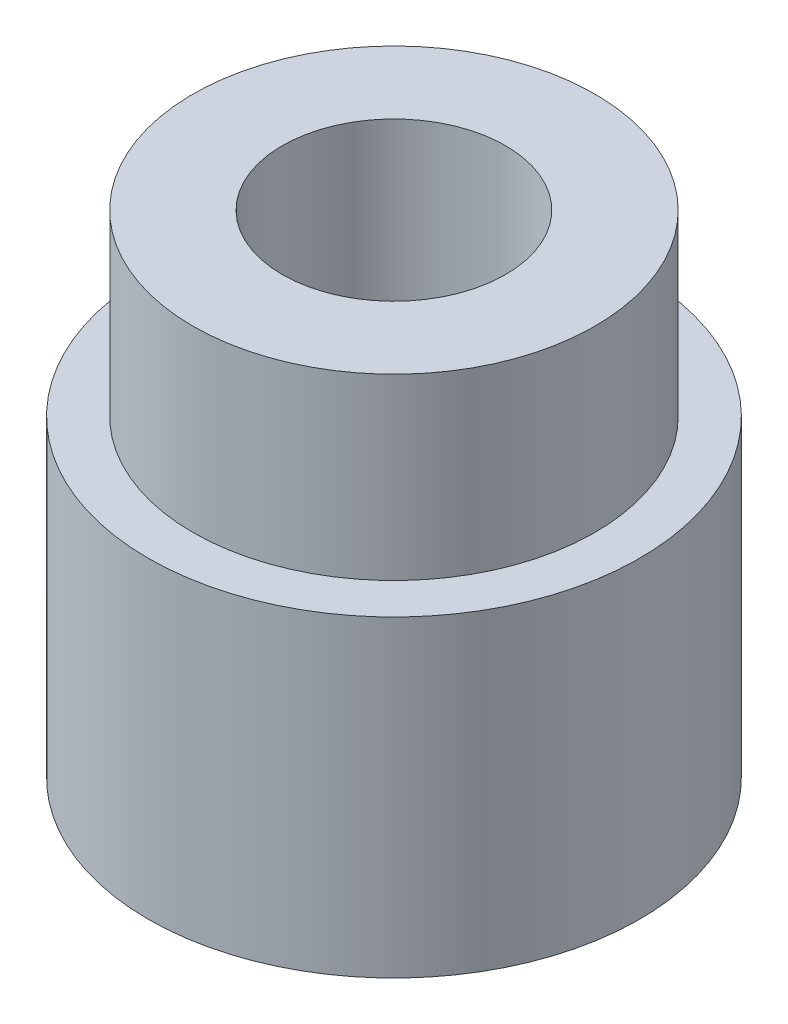
ISO-10303-21;
HEADER;
FILE_DESCRIPTION(('STEP AP214'),'2;1');
FILE_NAME('part.step','',(''),(''),'','','');
FILE_SCHEMA(('AUTOMOTIVE_DESIGN { 1 0 10303 214 1 1 1 1 }'));
ENDSEC;
DATA;
#1=APPLICATION_CONTEXT('core data for automotive mechanical design processes');
#2=APPLICATION_PROTOCOL_DEFINITION('international standard','automotive_design',2000,#1);
#3=PRODUCT_CONTEXT('',#1,'mechanical');
#4=PRODUCT('Part','Part','',(#3));
#5=PRODUCT_RELATED_PRODUCT_CATEGORY('part','',(#4));
#6=PRODUCT_DEFINITION_FORMATION('','',#4);
#7=PRODUCT_DEFINITION_CONTEXT('part definition',#1,'design');
#8=PRODUCT_DEFINITION('design','',#6,#7);
#9=PRODUCT_DEFINITION_SHAPE('','',#8);
#10=(LENGTH_UNIT() NAMED_UNIT(*) SI_UNIT(.MILLI.,.METRE.));
#11=(NAMED_UNIT(*) PLANE_ANGLE_UNIT() SI_UNIT($,.RADIAN.));
#12=(NAMED_UNIT(*) SI_UNIT($,.STERADIAN.) SOLID_ANGLE_UNIT());
#13=UNCERTAINTY_MEASURE_WITH_UNIT(LENGTH_MEASURE(1.E-05),#10,'distance_accuracy_value','');
#14=(GEOMETRIC_REPRESENTATION_CONTEXT(3) GLOBAL_UNCERTAINTY_ASSIGNED_CONTEXT((#13)) GLOBAL_UNIT_ASSIGNED_CONTEXT((#10,
#11,#12)) REPRESENTATION_CONTEXT('',''));
#15=CARTESIAN_POINT('',(0.,0.,0.));
#16=DIRECTION('',(0.,0.,1.));
#17=DIRECTION('',(1.,0.,0.));
#18=AXIS2_PLACEMENT_3D('',#15,#16,#17);
#19=CARTESIAN_POINT('',(0.,7.,0.));
#20=DIRECTION('',(0.,1.,0.));
#21=DIRECTION('',(0.,0.,1.));
#22=AXIS2_PLACEMENT_3D('',#19,#20,#21);
#23=PLANE('',#22);
#24=CARTESIAN_POINT('',(0.,7.,0.));
#25=DIRECTION('',(0.,1.,0.));
#26=DIRECTION('',(0.,0.,1.));
#27=AXIS2_PLACEMENT_3D('',#24,#25,#26);
#28=CIRCLE('',#27,5.5);
#29=CARTESIAN_POINT('',(0.,7.,5.5));
#30=VERTEX_POINT('',#29);
#31=EDGE_CURVE('E10',#30,#30,#28,.T.);
#32=ORIENTED_EDGE('',*,*,#31,.T.);
#33=EDGE_LOOP('',(#32));
#34=FACE_BOUND('',#33,.T.);
#35=CARTESIAN_POINT('',(0.,7.,0.));
#36=DIRECTION('',(0.,1.,0.));
#37=DIRECTION('',(0.,0.,1.));
#38=AXIS2_PLACEMENT_3D('',#35,#36,#37);
#39=CIRCLE('',#38,4.5);
#40=CARTESIAN_POINT('',(0.,7.,4.5));
#41=VERTEX_POINT('',#40);
#42=EDGE_CURVE('E44',#41,#41,#39,.T.);
#43=ORIENTED_EDGE('',*,*,#42,.F.);
#44=EDGE_LOOP('',(#43));
#45=FACE_BOUND('',#44,.T.);
#46=ADVANCED_FACE('F31',(#34,#45),#23,.T.);
#47=CARTESIAN_POINT('',(0.,7.,0.));
#48=DIRECTION('',(0.,-1.,0.));
#49=DIRECTION('',(0.,0.,-1.));
#50=AXIS2_PLACEMENT_3D('',#47,#48,#49);
#51=CYLINDRICAL_SURFACE('',#50,5.5);
#52=ORIENTED_EDGE('',*,*,#31,.F.);
#53=EDGE_LOOP('',(#52));
#54=FACE_BOUND('',#53,.T.);
#55=CARTESIAN_POINT('',(0.,0.,0.));
#56=DIRECTION('',(0.,1.,0.));
#57=DIRECTION('',(0.,0.,1.));
#58=AXIS2_PLACEMENT_3D('',#55,#56,#57);
#59=CIRCLE('',#58,5.5);
#60=CARTESIAN_POINT('',(0.,0.,5.5));
#61=VERTEX_POINT('',#60);
#62=EDGE_CURVE('E35',#61,#61,#59,.T.);
#63=ORIENTED_EDGE('',*,*,#62,.T.);
#64=EDGE_LOOP('',(#63));
#65=FACE_BOUND('',#64,.T.);
#66=ADVANCED_FACE('F33',(#54,#65),#51,.T.);
#67=CARTESIAN_POINT('',(0.,0.,0.));
#68=DIRECTION('',(0.,1.,0.));
#69=DIRECTION('',(0.,0.,1.));
#70=AXIS2_PLACEMENT_3D('',#67,#68,#69);
#71=PLANE('',#70);
#72=CARTESIAN_POINT('',(0.,0.,0.));
#73=DIRECTION('',(0.,1.,0.));
#74=DIRECTION('',(0.,0.,1.));
#75=AXIS2_PLACEMENT_3D('',#72,#73,#74);
#76=CIRCLE('',#75,2.5);
#77=CARTESIAN_POINT('',(0.,0.,2.5));
#78=VERTEX_POINT('',#77);
#79=EDGE_CURVE('E47',#78,#78,#76,.T.);
#80=ORIENTED_EDGE('',*,*,#79,.T.);
#81=EDGE_LOOP('',(#80));
#82=FACE_BOUND('',#81,.T.);
#83=ORIENTED_EDGE('',*,*,#62,.F.);
#84=EDGE_LOOP('',(#83));
#85=FACE_BOUND('',#84,.T.);
#86=ADVANCED_FACE('F56',(#82,#85),#71,.F.);
#87=CARTESIAN_POINT('',(0.,11.,0.));
#88=DIRECTION('',(0.,-1.,0.));
#89=DIRECTION('',(0.,0.,-1.));
#90=AXIS2_PLACEMENT_3D('',#87,#88,#89);
#91=CYLINDRICAL_SURFACE('',#90,4.5);
#92=CARTESIAN_POINT('',(0.,11.,0.));
#93=DIRECTION('',(0.,1.,0.));
#94=DIRECTION('',(0.,0.,1.));
#95=AXIS2_PLACEMENT_3D('',#92,#93,#94);
#96=CIRCLE('',#95,4.5);
#97=CARTESIAN_POINT('',(0.,11.,4.5));
#98=VERTEX_POINT('',#97);
#99=EDGE_CURVE('E42',#98,#98,#96,.T.);
#100=ORIENTED_EDGE('',*,*,#99,.F.);
#101=EDGE_LOOP('',(#100));
#102=FACE_BOUND('',#101,.T.);
#103=ORIENTED_EDGE('',*,*,#42,.T.);
#104=EDGE_LOOP('',(#103));
#105=FACE_BOUND('',#104,.T.);
#106=ADVANCED_FACE('F68',(#102,#105),#91,.T.);
#107=CARTESIAN_POINT('',(0.,11.,0.));
#108=DIRECTION('',(0.,1.,0.));
#109=DIRECTION('',(0.,0.,1.));
#110=AXIS2_PLACEMENT_3D('',#107,#108,#109);
#111=PLANE('',#110);
#112=CARTESIAN_POINT('',(0.,11.,0.));
#113=DIRECTION('',(0.,1.,0.));
#114=DIRECTION('',(0.,0.,1.));
#115=AXIS2_PLACEMENT_3D('',#112,#113,#114);
#116=CIRCLE('',#115,2.5);
#117=CARTESIAN_POINT('',(0.,11.,2.5));
#118=VERTEX_POINT('',#117);
#119=EDGE_CURVE('E50',#118,#118,#116,.T.);
#120=ORIENTED_EDGE('',*,*,#119,.F.);
#121=EDGE_LOOP('',(#120));
#122=FACE_BOUND('',#121,.T.);
#123=ORIENTED_EDGE('',*,*,#99,.T.);
#124=EDGE_LOOP('',(#123));
#125=FACE_BOUND('',#124,.T.);
#126=ADVANCED_FACE('F62',(#122,#125),#111,.T.);
#127=CARTESIAN_POINT('',(0.,0.,0.));
#128=DIRECTION('',(0.,1.,0.));
#129=DIRECTION('',(0.,0.,1.));
#130=AXIS2_PLACEMENT_3D('',#127,#128,#129);
#131=CYLINDRICAL_SURFACE('',#130,2.5);
#132=ORIENTED_EDGE('',*,*,#79,.F.);
#133=EDGE_LOOP('',(#132));
#134=FACE_BOUND('',#133,.T.);
#135=ORIENTED_EDGE('',*,*,#119,.T.);
#136=EDGE_LOOP('',(#135));
#137=FACE_BOUND('',#136,.T.);
#138=ADVANCED_FACE('F59',(#134,#137),#131,.F.);
#139=CLOSED_SHELL('',(#46,#66,#86,#106,#126,#138));
#140=MANIFOLD_SOLID_BREP('B2',#139);
#141=ADVANCED_BREP_SHAPE_REPRESENTATION('',(#18,#140),#14);
#142=SHAPE_DEFINITION_REPRESENTATION(#9,#141);
ENDSEC;
END-ISO-10303-21;
